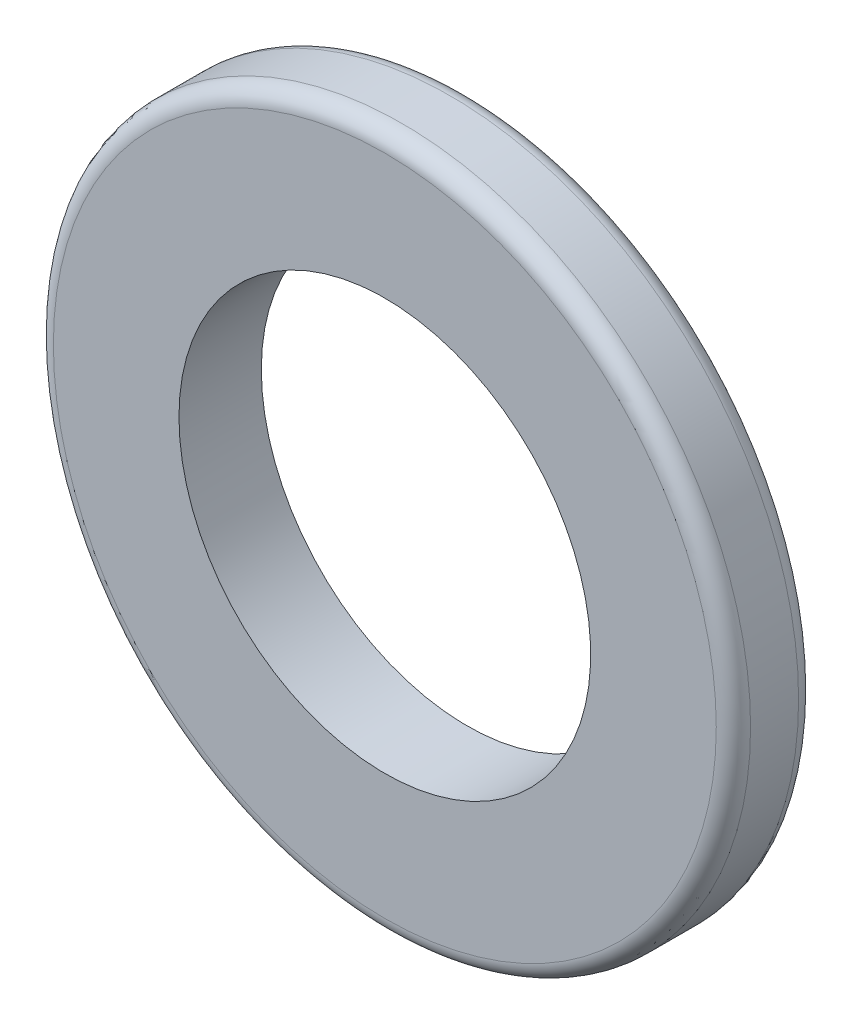
ISO-10303-21;
HEADER;
FILE_DESCRIPTION(('STEP AP214'),'2;1');
FILE_NAME('part.step','',(''),(''),'','','');
FILE_SCHEMA(('AUTOMOTIVE_DESIGN { 1 0 10303 214 1 1 1 1 }'));
ENDSEC;
DATA;
#1=APPLICATION_CONTEXT('core data for automotive mechanical design processes');
#2=APPLICATION_PROTOCOL_DEFINITION('international standard','automotive_design',2000,#1);
#3=PRODUCT_CONTEXT('',#1,'mechanical');
#4=PRODUCT('Part','Part','',(#3));
#5=PRODUCT_RELATED_PRODUCT_CATEGORY('part','',(#4));
#6=PRODUCT_DEFINITION_FORMATION('','',#4);
#7=PRODUCT_DEFINITION_CONTEXT('part definition',#1,'design');
#8=PRODUCT_DEFINITION('design','',#6,#7);
#9=PRODUCT_DEFINITION_SHAPE('','',#8);
#10=(LENGTH_UNIT() NAMED_UNIT(*) SI_UNIT(.MILLI.,.METRE.));
#11=(NAMED_UNIT(*) PLANE_ANGLE_UNIT() SI_UNIT($,.RADIAN.));
#12=(NAMED_UNIT(*) SI_UNIT($,.STERADIAN.) SOLID_ANGLE_UNIT());
#13=UNCERTAINTY_MEASURE_WITH_UNIT(LENGTH_MEASURE(1.E-05),#10,'distance_accuracy_value','');
#14=(GEOMETRIC_REPRESENTATION_CONTEXT(3) GLOBAL_UNCERTAINTY_ASSIGNED_CONTEXT((#13)) GLOBAL_UNIT_ASSIGNED_CONTEXT((#10,
#11,#12)) REPRESENTATION_CONTEXT('',''));
#15=CARTESIAN_POINT('',(0.,0.,0.));
#16=DIRECTION('',(0.,0.,1.));
#17=DIRECTION('',(1.,0.,0.));
#18=AXIS2_PLACEMENT_3D('',#15,#16,#17);
#19=CARTESIAN_POINT('',(0.,0.,19.));
#20=DIRECTION('',(0.,0.,1.));
#21=DIRECTION('',(1.,0.,0.));
#22=AXIS2_PLACEMENT_3D('',#19,#20,#21);
#23=TOROIDAL_SURFACE('',#22,96.5999999999999,5.);
#24=CARTESIAN_POINT('',(0.,0.,19.));
#25=DIRECTION('',(0.,0.,-1.));
#26=DIRECTION('',(-1.,0.,0.));
#27=AXIS2_PLACEMENT_3D('',#24,#25,#26);
#28=CIRCLE('',#27,101.6);
#29=CARTESIAN_POINT('',(-101.6,0.,19.));
#30=VERTEX_POINT('',#29);
#31=EDGE_CURVE('E51',#30,#30,#28,.T.);
#32=ORIENTED_EDGE('',*,*,#31,.F.);
#33=EDGE_LOOP('',(#32));
#34=FACE_BOUND('',#33,.T.);
#35=CARTESIAN_POINT('',(0.,0.,24.));
#36=DIRECTION('',(0.,0.,-1.));
#37=DIRECTION('',(1.,0.,0.));
#38=AXIS2_PLACEMENT_3D('',#35,#36,#37);
#39=CIRCLE('',#38,96.5999999999999);
#40=CARTESIAN_POINT('',(-96.5999999999999,0.,24.));
#41=VERTEX_POINT('',#40);
#42=CARTESIAN_POINT('',(96.5999999999999,0.,24.));
#43=VERTEX_POINT('',#42);
#44=EDGE_CURVE('E44',#41,#43,#39,.F.);
#45=ORIENTED_EDGE('',*,*,#44,.F.);
#46=CARTESIAN_POINT('',(0.,0.,24.));
#47=DIRECTION('',(0.,0.,-1.));
#48=DIRECTION('',(-1.,0.,0.));
#49=AXIS2_PLACEMENT_3D('',#46,#47,#48);
#50=CIRCLE('',#49,96.5999999999999);
#51=EDGE_CURVE('E47',#43,#41,#50,.F.);
#52=ORIENTED_EDGE('',*,*,#51,.F.);
#53=EDGE_LOOP('',(#45,#52));
#54=FACE_BOUND('',#53,.T.);
#55=ADVANCED_FACE('F16',(#34,#54),#23,.T.);
#56=CARTESIAN_POINT('',(0.,0.,24.));
#57=DIRECTION('',(0.,0.,-1.));
#58=DIRECTION('',(-1.,0.,0.));
#59=AXIS2_PLACEMENT_3D('',#56,#57,#58);
#60=CYLINDRICAL_SURFACE('',#59,101.6);
#61=ORIENTED_EDGE('',*,*,#31,.T.);
#62=EDGE_LOOP('',(#61));
#63=FACE_BOUND('',#62,.T.);
#64=CARTESIAN_POINT('',(0.,0.,5.));
#65=DIRECTION('',(0.,0.,1.));
#66=DIRECTION('',(1.,0.,0.));
#67=AXIS2_PLACEMENT_3D('',#64,#65,#66);
#68=CIRCLE('',#67,101.6);
#69=CARTESIAN_POINT('',(101.6,0.,5.));
#70=VERTEX_POINT('',#69);
#71=EDGE_CURVE('E55',#70,#70,#68,.F.);
#72=ORIENTED_EDGE('',*,*,#71,.F.);
#73=EDGE_LOOP('',(#72));
#74=FACE_BOUND('',#73,.T.);
#75=ADVANCED_FACE('F124',(#63,#74),#60,.T.);
#76=CARTESIAN_POINT('',(0.,0.,24.));
#77=DIRECTION('',(0.,0.,1.));
#78=DIRECTION('',(1.,0.,0.));
#79=AXIS2_PLACEMENT_3D('',#76,#77,#78);
#80=PLANE('',#79);
#81=CARTESIAN_POINT('',(0.,0.,24.));
#82=DIRECTION('',(0.,0.,-1.));
#83=DIRECTION('',(-1.,0.,0.));
#84=AXIS2_PLACEMENT_3D('',#81,#82,#83);
#85=CIRCLE('',#84,60.);
#86=CARTESIAN_POINT('',(-60.,0.,24.));
#87=VERTEX_POINT('',#86);
#88=EDGE_CURVE('E69',#87,#87,#85,.T.);
#89=ORIENTED_EDGE('',*,*,#88,.T.);
#90=EDGE_LOOP('',(#89));
#91=FACE_BOUND('',#90,.T.);
#92=ORIENTED_EDGE('',*,*,#51,.T.);
#93=ORIENTED_EDGE('',*,*,#44,.T.);
#94=EDGE_LOOP('',(#92,#93));
#95=FACE_BOUND('',#94,.T.);
#96=ADVANCED_FACE('F49',(#91,#95),#80,.T.);
#97=CARTESIAN_POINT('',(0.,0.,5.));
#98=DIRECTION('',(0.,0.,1.));
#99=DIRECTION('',(1.,0.,0.));
#100=AXIS2_PLACEMENT_3D('',#97,#98,#99);
#101=TOROIDAL_SURFACE('',#100,96.5999999999999,5.);
#102=CARTESIAN_POINT('',(0.,0.,0.));
#103=DIRECTION('',(0.,0.,1.));
#104=DIRECTION('',(1.,0.,0.));
#105=AXIS2_PLACEMENT_3D('',#102,#103,#104);
#106=CIRCLE('',#105,96.5999999999999);
#107=CARTESIAN_POINT('',(96.5999999999999,0.,0.));
#108=VERTEX_POINT('',#107);
#109=CARTESIAN_POINT('',(-96.5999999999999,0.,0.));
#110=VERTEX_POINT('',#109);
#111=EDGE_CURVE('E72',#108,#110,#106,.T.);
#112=ORIENTED_EDGE('',*,*,#111,.T.);
#113=CARTESIAN_POINT('',(0.,0.,0.));
#114=DIRECTION('',(0.,0.,1.));
#115=DIRECTION('',(-1.,0.,0.));
#116=AXIS2_PLACEMENT_3D('',#113,#114,#115);
#117=CIRCLE('',#116,96.5999999999999);
#118=EDGE_CURVE('E28',#110,#108,#117,.T.);
#119=ORIENTED_EDGE('',*,*,#118,.T.);
#120=EDGE_LOOP('',(#112,#119));
#121=FACE_BOUND('',#120,.T.);
#122=ORIENTED_EDGE('',*,*,#71,.T.);
#123=EDGE_LOOP('',(#122));
#124=FACE_BOUND('',#123,.T.);
#125=ADVANCED_FACE('F78',(#121,#124),#101,.T.);
#126=CARTESIAN_POINT('',(0.,0.,24.));
#127=DIRECTION('',(0.,0.,-1.));
#128=DIRECTION('',(-1.,0.,0.));
#129=AXIS2_PLACEMENT_3D('',#126,#127,#128);
#130=CYLINDRICAL_SURFACE('',#129,60.);
#131=CARTESIAN_POINT('',(0.,0.,0.));
#132=DIRECTION('',(0.,0.,-1.));
#133=DIRECTION('',(-1.,0.,0.));
#134=AXIS2_PLACEMENT_3D('',#131,#132,#133);
#135=CIRCLE('',#134,60.);
#136=CARTESIAN_POINT('',(-60.,0.,0.));
#137=VERTEX_POINT('',#136);
#138=EDGE_CURVE('E11',#137,#137,#135,.T.);
#139=ORIENTED_EDGE('',*,*,#138,.T.);
#140=EDGE_LOOP('',(#139));
#141=FACE_BOUND('',#140,.T.);
#142=ORIENTED_EDGE('',*,*,#88,.F.);
#143=EDGE_LOOP('',(#142));
#144=FACE_BOUND('',#143,.T.);
#145=ADVANCED_FACE('F89',(#141,#144),#130,.F.);
#146=CARTESIAN_POINT('',(0.,0.,0.));
#147=DIRECTION('',(0.,0.,1.));
#148=DIRECTION('',(1.,0.,0.));
#149=AXIS2_PLACEMENT_3D('',#146,#147,#148);
#150=PLANE('',#149);
#151=ORIENTED_EDGE('',*,*,#138,.F.);
#152=EDGE_LOOP('',(#151));
#153=FACE_BOUND('',#152,.T.);
#154=ORIENTED_EDGE('',*,*,#111,.F.);
#155=ORIENTED_EDGE('',*,*,#118,.F.);
#156=EDGE_LOOP('',(#154,#155));
#157=FACE_BOUND('',#156,.T.);
#158=ADVANCED_FACE('F134',(#153,#157),#150,.F.);
#159=CLOSED_SHELL('',(#55,#75,#96,#125,#145,#158));
#160=MANIFOLD_SOLID_BREP('B1',#159);
#161=ADVANCED_BREP_SHAPE_REPRESENTATION('',(#18,#160),#14);
#162=SHAPE_DEFINITION_REPRESENTATION(#9,#161);
ENDSEC;
END-ISO-10303-21;
